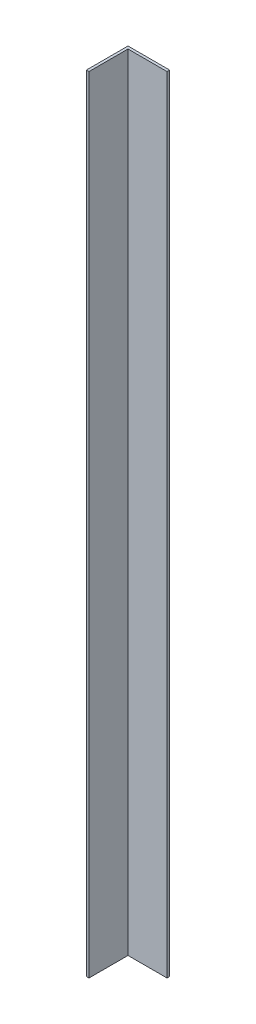
ISO-10303-21;
HEADER;
FILE_DESCRIPTION(('STEP AP214'),'2;1');
FILE_NAME('part.step','',(''),(''),'','','');
FILE_SCHEMA(('AUTOMOTIVE_DESIGN { 1 0 10303 214 1 1 1 1 }'));
ENDSEC;
DATA;
#1=APPLICATION_CONTEXT('core data for automotive mechanical design processes');
#2=APPLICATION_PROTOCOL_DEFINITION('international standard','automotive_design',2000,#1);
#3=PRODUCT_CONTEXT('',#1,'mechanical');
#4=PRODUCT('Part','Part','',(#3));
#5=PRODUCT_RELATED_PRODUCT_CATEGORY('part','',(#4));
#6=PRODUCT_DEFINITION_FORMATION('','',#4);
#7=PRODUCT_DEFINITION_CONTEXT('part definition',#1,'design');
#8=PRODUCT_DEFINITION('design','',#6,#7);
#9=PRODUCT_DEFINITION_SHAPE('','',#8);
#10=(LENGTH_UNIT() NAMED_UNIT(*) SI_UNIT(.MILLI.,.METRE.));
#11=(NAMED_UNIT(*) PLANE_ANGLE_UNIT() SI_UNIT($,.RADIAN.));
#12=(NAMED_UNIT(*) SI_UNIT($,.STERADIAN.) SOLID_ANGLE_UNIT());
#13=UNCERTAINTY_MEASURE_WITH_UNIT(LENGTH_MEASURE(1.E-05),#10,'distance_accuracy_value','');
#14=(GEOMETRIC_REPRESENTATION_CONTEXT(3) GLOBAL_UNCERTAINTY_ASSIGNED_CONTEXT((#13)) GLOBAL_UNIT_ASSIGNED_CONTEXT((#10,
#11,#12)) REPRESENTATION_CONTEXT('',''));
#15=CARTESIAN_POINT('',(0.,0.,0.));
#16=DIRECTION('',(0.,0.,1.));
#17=DIRECTION('',(1.,0.,0.));
#18=AXIS2_PLACEMENT_3D('',#15,#16,#17);
#19=CARTESIAN_POINT('',(0.,479.425,0.));
#20=DIRECTION('',(1.,0.,0.));
#21=DIRECTION('',(0.,0.,-1.));
#22=AXIS2_PLACEMENT_3D('',#19,#20,#21);
#23=PLANE('',#22);
#24=DIRECTION('',(0.,0.,1.));
#25=VECTOR('',#24,1.);
#26=CARTESIAN_POINT('',(0.,0.,0.));
#27=LINE('',#26,#25);
#28=CARTESIAN_POINT('',(0.,0.,0.));
#29=VERTEX_POINT('',#28);
#30=CARTESIAN_POINT('',(0.,0.,25.4));
#31=VERTEX_POINT('',#30);
#32=EDGE_CURVE('E119',#29,#31,#27,.T.);
#33=ORIENTED_EDGE('',*,*,#32,.T.);
#34=DIRECTION('',(0.,-1.,0.));
#35=VECTOR('',#34,1.);
#36=CARTESIAN_POINT('',(0.,479.425,25.4));
#37=LINE('',#36,#35);
#38=CARTESIAN_POINT('',(0.,479.425,25.4));
#39=VERTEX_POINT('',#38);
#40=EDGE_CURVE('E11',#39,#31,#37,.T.);
#41=ORIENTED_EDGE('',*,*,#40,.F.);
#42=DIRECTION('',(0.,0.,1.));
#43=VECTOR('',#42,1.);
#44=CARTESIAN_POINT('',(0.,479.425,0.));
#45=LINE('',#44,#43);
#46=CARTESIAN_POINT('',(0.,479.425,0.));
#47=VERTEX_POINT('',#46);
#48=EDGE_CURVE('E116',#47,#39,#45,.T.);
#49=ORIENTED_EDGE('',*,*,#48,.F.);
#50=DIRECTION('',(0.,-1.,0.));
#51=VECTOR('',#50,1.);
#52=CARTESIAN_POINT('',(0.,479.425,0.));
#53=LINE('',#52,#51);
#54=EDGE_CURVE('E123',#47,#29,#53,.T.);
#55=ORIENTED_EDGE('',*,*,#54,.T.);
#56=EDGE_LOOP('',(#33,#41,#49,#55));
#57=FACE_BOUND('',#56,.T.);
#58=ADVANCED_FACE('F33',(#57),#23,.F.);
#59=CARTESIAN_POINT('',(0.,479.425,25.4));
#60=DIRECTION('',(0.,0.,-1.));
#61=DIRECTION('',(-1.,0.,0.));
#62=AXIS2_PLACEMENT_3D('',#59,#60,#61);
#63=PLANE('',#62);
#64=DIRECTION('',(1.,0.,0.));
#65=VECTOR('',#64,1.);
#66=CARTESIAN_POINT('',(0.,0.,25.4));
#67=LINE('',#66,#65);
#68=CARTESIAN_POINT('',(1.5875,0.,25.4));
#69=VERTEX_POINT('',#68);
#70=EDGE_CURVE('E114',#31,#69,#67,.T.);
#71=ORIENTED_EDGE('',*,*,#70,.T.);
#72=DIRECTION('',(0.,1.,0.));
#73=VECTOR('',#72,1.);
#74=CARTESIAN_POINT('',(1.5875,0.,25.4));
#75=LINE('',#74,#73);
#76=CARTESIAN_POINT('',(1.5875,479.425,25.4));
#77=VERTEX_POINT('',#76);
#78=EDGE_CURVE('E130',#69,#77,#75,.T.);
#79=ORIENTED_EDGE('',*,*,#78,.T.);
#80=DIRECTION('',(1.,0.,0.));
#81=VECTOR('',#80,1.);
#82=CARTESIAN_POINT('',(0.,479.425,25.4));
#83=LINE('',#82,#81);
#84=EDGE_CURVE('E79',#39,#77,#83,.T.);
#85=ORIENTED_EDGE('',*,*,#84,.F.);
#86=ORIENTED_EDGE('',*,*,#40,.T.);
#87=EDGE_LOOP('',(#71,#79,#85,#86));
#88=FACE_BOUND('',#87,.T.);
#89=ADVANCED_FACE('F140',(#88),#63,.F.);
#90=CARTESIAN_POINT('',(25.4,479.425,0.));
#91=DIRECTION('',(-1.,0.,0.));
#92=DIRECTION('',(0.,0.,1.));
#93=AXIS2_PLACEMENT_3D('',#90,#91,#92);
#94=PLANE('',#93);
#95=DIRECTION('',(0.,0.,-1.));
#96=VECTOR('',#95,1.);
#97=CARTESIAN_POINT('',(25.4,479.425,0.));
#98=LINE('',#97,#96);
#99=CARTESIAN_POINT('',(25.4,479.425,1.5875));
#100=VERTEX_POINT('',#99);
#101=CARTESIAN_POINT('',(25.4,479.425,0.));
#102=VERTEX_POINT('',#101);
#103=EDGE_CURVE('E110',#100,#102,#98,.T.);
#104=ORIENTED_EDGE('',*,*,#103,.F.);
#105=DIRECTION('',(0.,1.,0.));
#106=VECTOR('',#105,1.);
#107=CARTESIAN_POINT('',(25.4,0.,1.5875));
#108=LINE('',#107,#106);
#109=CARTESIAN_POINT('',(25.4,0.,1.5875));
#110=VERTEX_POINT('',#109);
#111=EDGE_CURVE('E98',#110,#100,#108,.T.);
#112=ORIENTED_EDGE('',*,*,#111,.F.);
#113=DIRECTION('',(0.,0.,-1.));
#114=VECTOR('',#113,1.);
#115=CARTESIAN_POINT('',(25.4,0.,0.));
#116=LINE('',#115,#114);
#117=CARTESIAN_POINT('',(25.4,0.,0.));
#118=VERTEX_POINT('',#117);
#119=EDGE_CURVE('E109',#110,#118,#116,.T.);
#120=ORIENTED_EDGE('',*,*,#119,.T.);
#121=DIRECTION('',(0.,-1.,0.));
#122=VECTOR('',#121,1.);
#123=CARTESIAN_POINT('',(25.4,479.425,0.));
#124=LINE('',#123,#122);
#125=EDGE_CURVE('E40',#102,#118,#124,.T.);
#126=ORIENTED_EDGE('',*,*,#125,.F.);
#127=EDGE_LOOP('',(#104,#112,#120,#126));
#128=FACE_BOUND('',#127,.T.);
#129=ADVANCED_FACE('F107',(#128),#94,.F.);
#130=CARTESIAN_POINT('',(0.,479.425,0.));
#131=DIRECTION('',(0.,0.,1.));
#132=DIRECTION('',(1.,0.,0.));
#133=AXIS2_PLACEMENT_3D('',#130,#131,#132);
#134=PLANE('',#133);
#135=DIRECTION('',(-1.,0.,0.));
#136=VECTOR('',#135,1.);
#137=CARTESIAN_POINT('',(0.,0.,0.));
#138=LINE('',#137,#136);
#139=EDGE_CURVE('E73',#118,#29,#138,.T.);
#140=ORIENTED_EDGE('',*,*,#139,.T.);
#141=ORIENTED_EDGE('',*,*,#54,.F.);
#142=DIRECTION('',(-1.,0.,0.));
#143=VECTOR('',#142,1.);
#144=CARTESIAN_POINT('',(0.,479.425,0.));
#145=LINE('',#144,#143);
#146=EDGE_CURVE('E56',#102,#47,#145,.T.);
#147=ORIENTED_EDGE('',*,*,#146,.F.);
#148=ORIENTED_EDGE('',*,*,#125,.T.);
#149=EDGE_LOOP('',(#140,#141,#147,#148));
#150=FACE_BOUND('',#149,.T.);
#151=ADVANCED_FACE('F124',(#150),#134,.F.);
#152=CARTESIAN_POINT('',(0.,479.425,0.));
#153=DIRECTION('',(0.,1.,0.));
#154=DIRECTION('',(0.,0.,1.));
#155=AXIS2_PLACEMENT_3D('',#152,#153,#154);
#156=PLANE('',#155);
#157=DIRECTION('',(0.,0.,1.));
#158=VECTOR('',#157,1.);
#159=CARTESIAN_POINT('',(1.5875,479.425,1.5875));
#160=LINE('',#159,#158);
#161=CARTESIAN_POINT('',(1.5875,479.425,1.5875));
#162=VERTEX_POINT('',#161);
#163=EDGE_CURVE('E103',#162,#77,#160,.T.);
#164=ORIENTED_EDGE('',*,*,#163,.F.);
#165=DIRECTION('',(-1.,0.,0.));
#166=VECTOR('',#165,1.);
#167=CARTESIAN_POINT('',(25.4,479.425,1.5875));
#168=LINE('',#167,#166);
#169=EDGE_CURVE('E142',#100,#162,#168,.T.);
#170=ORIENTED_EDGE('',*,*,#169,.F.);
#171=ORIENTED_EDGE('',*,*,#103,.T.);
#172=ORIENTED_EDGE('',*,*,#146,.T.);
#173=ORIENTED_EDGE('',*,*,#48,.T.);
#174=ORIENTED_EDGE('',*,*,#84,.T.);
#175=EDGE_LOOP('',(#164,#170,#171,#172,#173,#174));
#176=FACE_BOUND('',#175,.T.);
#177=ADVANCED_FACE('F139',(#176),#156,.T.);
#178=CARTESIAN_POINT('',(0.,0.,0.));
#179=DIRECTION('',(0.,1.,0.));
#180=DIRECTION('',(0.,0.,1.));
#181=AXIS2_PLACEMENT_3D('',#178,#179,#180);
#182=PLANE('',#181);
#183=DIRECTION('',(-1.,0.,0.));
#184=VECTOR('',#183,1.);
#185=CARTESIAN_POINT('',(25.4,0.,1.5875));
#186=LINE('',#185,#184);
#187=CARTESIAN_POINT('',(1.5875,0.,1.5875));
#188=VERTEX_POINT('',#187);
#189=EDGE_CURVE('E94',#110,#188,#186,.T.);
#190=ORIENTED_EDGE('',*,*,#189,.T.);
#191=DIRECTION('',(0.,0.,1.));
#192=VECTOR('',#191,1.);
#193=CARTESIAN_POINT('',(1.5875,0.,1.5875));
#194=LINE('',#193,#192);
#195=EDGE_CURVE('E47',#188,#69,#194,.T.);
#196=ORIENTED_EDGE('',*,*,#195,.T.);
#197=ORIENTED_EDGE('',*,*,#70,.F.);
#198=ORIENTED_EDGE('',*,*,#32,.F.);
#199=ORIENTED_EDGE('',*,*,#139,.F.);
#200=ORIENTED_EDGE('',*,*,#119,.F.);
#201=EDGE_LOOP('',(#190,#196,#197,#198,#199,#200));
#202=FACE_BOUND('',#201,.T.);
#203=ADVANCED_FACE('F112',(#202),#182,.F.);
#204=CARTESIAN_POINT('',(1.5875,0.,1.5875));
#205=DIRECTION('',(-1.,0.,0.));
#206=DIRECTION('',(0.,0.,1.));
#207=AXIS2_PLACEMENT_3D('',#204,#205,#206);
#208=PLANE('',#207);
#209=ORIENTED_EDGE('',*,*,#163,.T.);
#210=ORIENTED_EDGE('',*,*,#78,.F.);
#211=ORIENTED_EDGE('',*,*,#195,.F.);
#212=DIRECTION('',(0.,1.,0.));
#213=VECTOR('',#212,1.);
#214=CARTESIAN_POINT('',(1.5875,0.,1.5875));
#215=LINE('',#214,#213);
#216=EDGE_CURVE('E100',#188,#162,#215,.T.);
#217=ORIENTED_EDGE('',*,*,#216,.T.);
#218=EDGE_LOOP('',(#209,#210,#211,#217));
#219=FACE_BOUND('',#218,.T.);
#220=ADVANCED_FACE('F143',(#219),#208,.F.);
#221=CARTESIAN_POINT('',(25.4,0.,1.5875));
#222=DIRECTION('',(0.,0.,-1.));
#223=DIRECTION('',(-1.,0.,0.));
#224=AXIS2_PLACEMENT_3D('',#221,#222,#223);
#225=PLANE('',#224);
#226=ORIENTED_EDGE('',*,*,#169,.T.);
#227=ORIENTED_EDGE('',*,*,#216,.F.);
#228=ORIENTED_EDGE('',*,*,#189,.F.);
#229=ORIENTED_EDGE('',*,*,#111,.T.);
#230=EDGE_LOOP('',(#226,#227,#228,#229));
#231=FACE_BOUND('',#230,.T.);
#232=ADVANCED_FACE('F97',(#231),#225,.F.);
#233=CLOSED_SHELL('',(#58,#89,#129,#151,#177,#203,#220,#232));
#234=MANIFOLD_SOLID_BREP('B2',#233);
#235=ADVANCED_BREP_SHAPE_REPRESENTATION('',(#18,#234),#14);
#236=SHAPE_DEFINITION_REPRESENTATION(#9,#235);
ENDSEC;
END-ISO-10303-21;
